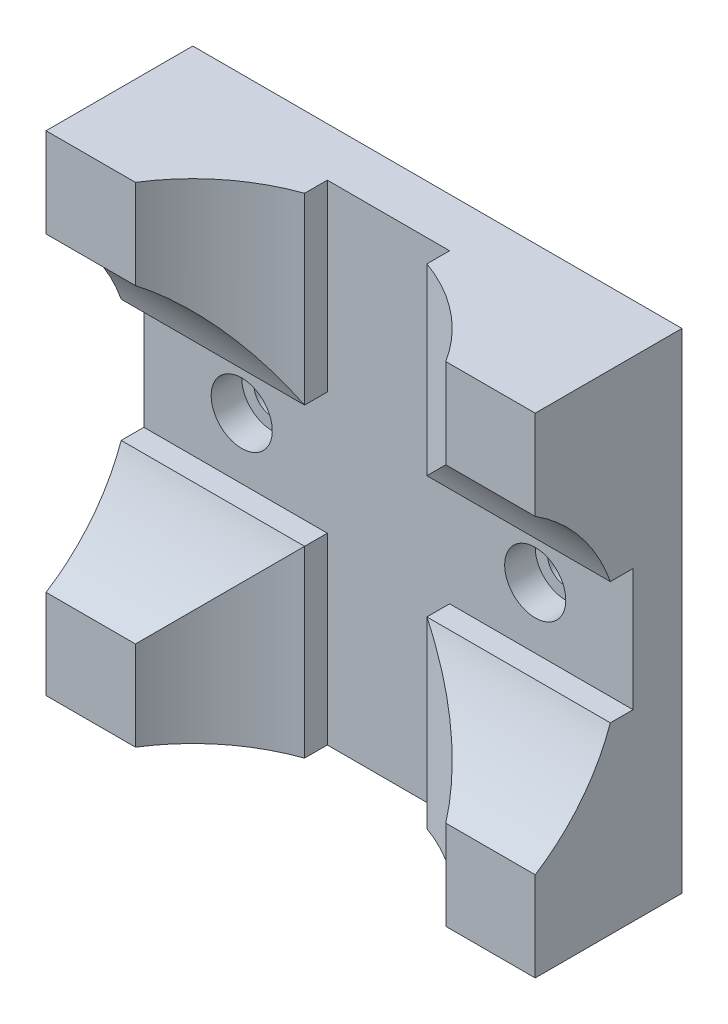
ISO-10303-21;
HEADER;
FILE_DESCRIPTION(('STEP AP214'),'2;1');
FILE_NAME('part.step','',(''),(''),'','','');
FILE_SCHEMA(('AUTOMOTIVE_DESIGN { 1 0 10303 214 1 1 1 1 }'));
ENDSEC;
DATA;
#1=APPLICATION_CONTEXT('core data for automotive mechanical design processes');
#2=APPLICATION_PROTOCOL_DEFINITION('international standard','automotive_design',2000,#1);
#3=PRODUCT_CONTEXT('',#1,'mechanical');
#4=PRODUCT('Part','Part','',(#3));
#5=PRODUCT_RELATED_PRODUCT_CATEGORY('part','',(#4));
#6=PRODUCT_DEFINITION_FORMATION('','',#4);
#7=PRODUCT_DEFINITION_CONTEXT('part definition',#1,'design');
#8=PRODUCT_DEFINITION('design','',#6,#7);
#9=PRODUCT_DEFINITION_SHAPE('','',#8);
#10=(LENGTH_UNIT() NAMED_UNIT(*) SI_UNIT(.MILLI.,.METRE.));
#11=(NAMED_UNIT(*) PLANE_ANGLE_UNIT() SI_UNIT($,.RADIAN.));
#12=(NAMED_UNIT(*) SI_UNIT($,.STERADIAN.) SOLID_ANGLE_UNIT());
#13=UNCERTAINTY_MEASURE_WITH_UNIT(LENGTH_MEASURE(1.E-05),#10,'distance_accuracy_value','');
#14=(GEOMETRIC_REPRESENTATION_CONTEXT(3) GLOBAL_UNCERTAINTY_ASSIGNED_CONTEXT((#13)) GLOBAL_UNIT_ASSIGNED_CONTEXT((#10,
#11,#12)) REPRESENTATION_CONTEXT('',''));
#15=CARTESIAN_POINT('',(0.,0.,0.));
#16=DIRECTION('',(0.,0.,1.));
#17=DIRECTION('',(1.,0.,0.));
#18=AXIS2_PLACEMENT_3D('',#15,#16,#17);
#19=CARTESIAN_POINT('',(0.,0.,12.));
#20=DIRECTION('',(0.,0.,-1.));
#21=DIRECTION('',(-1.,0.,0.));
#22=AXIS2_PLACEMENT_3D('',#19,#20,#21);
#23=PLANE('',#22);
#24=DIRECTION('',(-1.,0.,0.));
#25=VECTOR('',#24,1.);
#26=CARTESIAN_POINT('',(0.,40.,12.));
#27=LINE('',#26,#25);
#28=CARTESIAN_POINT('',(40.,40.,12.));
#29=VERTEX_POINT('',#28);
#30=CARTESIAN_POINT('',(32.6885775404496,40.,12.));
#31=VERTEX_POINT('',#30);
#32=EDGE_CURVE('E395',#29,#31,#27,.T.);
#33=ORIENTED_EDGE('',*,*,#32,.T.);
#34=DIRECTION('',(0.,-1.,0.));
#35=VECTOR('',#34,1.);
#36=CARTESIAN_POINT('',(32.6885775404496,40.,12.));
#37=LINE('',#36,#35);
#38=CARTESIAN_POINT('',(32.6885775404496,32.6885775404495,12.));
#39=VERTEX_POINT('',#38);
#40=EDGE_CURVE('E303',#31,#39,#37,.T.);
#41=ORIENTED_EDGE('',*,*,#40,.T.);
#42=DIRECTION('',(1.,0.,0.));
#43=VECTOR('',#42,1.);
#44=CARTESIAN_POINT('',(0.,32.6885775404495,12.));
#45=LINE('',#44,#43);
#46=CARTESIAN_POINT('',(40.,32.6885775404495,12.));
#47=VERTEX_POINT('',#46);
#48=EDGE_CURVE('E432',#39,#47,#45,.T.);
#49=ORIENTED_EDGE('',*,*,#48,.T.);
#50=DIRECTION('',(0.,1.,0.));
#51=VECTOR('',#50,1.);
#52=CARTESIAN_POINT('',(40.,0.,12.));
#53=LINE('',#52,#51);
#54=EDGE_CURVE('E389',#47,#29,#53,.T.);
#55=ORIENTED_EDGE('',*,*,#54,.T.);
#56=EDGE_LOOP('',(#33,#41,#49,#55));
#57=FACE_BOUND('',#56,.T.);
#58=ADVANCED_FACE('F52',(#57),#23,.F.);
#59=DIRECTION('',(1.,0.,0.));
#60=VECTOR('',#59,1.);
#61=CARTESIAN_POINT('',(0.,7.31142245955047,12.));
#62=LINE('',#61,#60);
#63=CARTESIAN_POINT('',(40.,7.31142245955048,12.));
#64=VERTEX_POINT('',#63);
#65=CARTESIAN_POINT('',(32.6885775404495,7.31142245955048,12.));
#66=VERTEX_POINT('',#65);
#67=EDGE_CURVE('E428',#64,#66,#62,.F.);
#68=ORIENTED_EDGE('',*,*,#67,.T.);
#69=DIRECTION('',(0.,-1.,0.));
#70=VECTOR('',#69,1.);
#71=CARTESIAN_POINT('',(32.6885775404496,40.,12.));
#72=LINE('',#71,#70);
#73=CARTESIAN_POINT('',(32.6885775404495,0.,12.));
#74=VERTEX_POINT('',#73);
#75=EDGE_CURVE('E279',#66,#74,#72,.T.);
#76=ORIENTED_EDGE('',*,*,#75,.T.);
#77=DIRECTION('',(1.,0.,0.));
#78=VECTOR('',#77,1.);
#79=CARTESIAN_POINT('',(0.,0.,12.));
#80=LINE('',#79,#78);
#81=CARTESIAN_POINT('',(40.,0.,12.));
#82=VERTEX_POINT('',#81);
#83=EDGE_CURVE('E383',#74,#82,#80,.T.);
#84=ORIENTED_EDGE('',*,*,#83,.T.);
#85=EDGE_CURVE('E390',#82,#64,#53,.T.);
#86=ORIENTED_EDGE('',*,*,#85,.T.);
#87=EDGE_LOOP('',(#68,#76,#84,#86));
#88=FACE_BOUND('',#87,.T.);
#89=ADVANCED_FACE('F461',(#88),#23,.F.);
#90=CARTESIAN_POINT('',(0.,20.,20.));
#91=DIRECTION('',(1.,0.,0.));
#92=DIRECTION('',(0.,1.,0.));
#93=AXIS2_PLACEMENT_3D('',#90,#91,#92);
#94=CYLINDRICAL_SURFACE('',#93,15.);
#95=ORIENTED_EDGE('',*,*,#48,.F.);
#96=CARTESIAN_POINT('',(20.,20.,20.));
#97=DIRECTION('',(0.707106781186546,-0.707106781186549,0.));
#98=DIRECTION('',(0.707106781186549,0.707106781186546,0.));
#99=AXIS2_PLACEMENT_3D('',#96,#97,#98);
#100=ELLIPSE('',#99,21.2132034355965,15.);
#101=CARTESIAN_POINT('',(25.,25.,5.85786437626905));
#102=VERTEX_POINT('',#101);
#103=EDGE_CURVE('E299',#39,#102,#100,.F.);
#104=ORIENTED_EDGE('',*,*,#103,.T.);
#105=DIRECTION('',(1.,0.,0.));
#106=VECTOR('',#105,1.);
#107=CARTESIAN_POINT('',(0.,25.,5.85786437626905));
#108=LINE('',#107,#106);
#109=CARTESIAN_POINT('',(40.,25.,5.85786437626905));
#110=VERTEX_POINT('',#109);
#111=EDGE_CURVE('E370',#102,#110,#108,.T.);
#112=ORIENTED_EDGE('',*,*,#111,.T.);
#113=CARTESIAN_POINT('',(40.,20.,20.));
#114=DIRECTION('',(1.,0.,0.));
#115=DIRECTION('',(0.,1.,0.));
#116=AXIS2_PLACEMENT_3D('',#113,#114,#115);
#117=CIRCLE('',#116,15.);
#118=EDGE_CURVE('E353',#110,#47,#117,.T.);
#119=ORIENTED_EDGE('',*,*,#118,.T.);
#120=EDGE_LOOP('',(#95,#104,#112,#119));
#121=FACE_BOUND('',#120,.T.);
#122=ADVANCED_FACE('F472',(#121),#94,.F.);
#123=CARTESIAN_POINT('',(7.31142245955043,7.31142245955047,12.));
#124=VERTEX_POINT('',#123);
#125=CARTESIAN_POINT('',(0.,7.31142245955047,12.));
#126=VERTEX_POINT('',#125);
#127=EDGE_CURVE('E427',#124,#126,#62,.F.);
#128=ORIENTED_EDGE('',*,*,#127,.F.);
#129=CARTESIAN_POINT('',(20.,20.,20.));
#130=DIRECTION('',(0.707106781186546,-0.707106781186549,0.));
#131=DIRECTION('',(0.707106781186549,0.707106781186546,0.));
#132=AXIS2_PLACEMENT_3D('',#129,#130,#131);
#133=ELLIPSE('',#132,21.2132034355965,15.);
#134=CARTESIAN_POINT('',(15.,15.,5.85786437626905));
#135=VERTEX_POINT('',#134);
#136=EDGE_CURVE('E283',#124,#135,#133,.T.);
#137=ORIENTED_EDGE('',*,*,#136,.T.);
#138=DIRECTION('',(1.,0.,0.));
#139=VECTOR('',#138,1.);
#140=CARTESIAN_POINT('',(0.,15.,5.85786437626905));
#141=LINE('',#140,#139);
#142=CARTESIAN_POINT('',(0.,15.,5.85786437626905));
#143=VERTEX_POINT('',#142);
#144=EDGE_CURVE('E360',#143,#135,#141,.T.);
#145=ORIENTED_EDGE('',*,*,#144,.F.);
#146=CARTESIAN_POINT('',(0.,20.,20.));
#147=DIRECTION('',(1.,0.,0.));
#148=DIRECTION('',(0.,1.,0.));
#149=AXIS2_PLACEMENT_3D('',#146,#147,#148);
#150=CIRCLE('',#149,15.);
#151=EDGE_CURVE('E337',#126,#143,#150,.T.);
#152=ORIENTED_EDGE('',*,*,#151,.F.);
#153=EDGE_LOOP('',(#128,#137,#145,#152));
#154=FACE_BOUND('',#153,.T.);
#155=ADVANCED_FACE('F548',(#154),#94,.F.);
#156=CARTESIAN_POINT('',(0.,15.,5.));
#157=DIRECTION('',(0.,-1.,0.));
#158=DIRECTION('',(1.,0.,0.));
#159=AXIS2_PLACEMENT_3D('',#156,#157,#158);
#160=PLANE('',#159);
#161=ORIENTED_EDGE('',*,*,#144,.T.);
#162=DIRECTION('',(0.,0.,-1.));
#163=VECTOR('',#162,1.);
#164=CARTESIAN_POINT('',(15.,15.,5.));
#165=LINE('',#164,#163);
#166=CARTESIAN_POINT('',(15.,15.,4.));
#167=VERTEX_POINT('',#166);
#168=EDGE_CURVE('E271',#135,#167,#165,.T.);
#169=ORIENTED_EDGE('',*,*,#168,.T.);
#170=DIRECTION('',(1.,0.,0.));
#171=VECTOR('',#170,1.);
#172=CARTESIAN_POINT('',(0.,15.,4.));
#173=LINE('',#172,#171);
#174=CARTESIAN_POINT('',(0.,15.,4.));
#175=VERTEX_POINT('',#174);
#176=EDGE_CURVE('E375',#175,#167,#173,.T.);
#177=ORIENTED_EDGE('',*,*,#176,.F.);
#178=DIRECTION('',(0.,0.,-1.));
#179=VECTOR('',#178,1.);
#180=CARTESIAN_POINT('',(0.,15.,4.));
#181=LINE('',#180,#179);
#182=EDGE_CURVE('E324',#143,#175,#181,.T.);
#183=ORIENTED_EDGE('',*,*,#182,.F.);
#184=EDGE_LOOP('',(#161,#169,#177,#183));
#185=FACE_BOUND('',#184,.T.);
#186=ADVANCED_FACE('F544',(#185),#160,.F.);
#187=CARTESIAN_POINT('',(0.,25.,5.85786437626905));
#188=DIRECTION('',(0.,1.,0.));
#189=DIRECTION('',(-1.,0.,0.));
#190=AXIS2_PLACEMENT_3D('',#187,#188,#189);
#191=PLANE('',#190);
#192=DIRECTION('',(1.,0.,0.));
#193=VECTOR('',#192,1.);
#194=CARTESIAN_POINT('',(0.,25.,4.));
#195=LINE('',#194,#193);
#196=CARTESIAN_POINT('',(0.,25.,4.));
#197=VERTEX_POINT('',#196);
#198=CARTESIAN_POINT('',(15.,25.,4.));
#199=VERTEX_POINT('',#198);
#200=EDGE_CURVE('E371',#197,#199,#195,.T.);
#201=ORIENTED_EDGE('',*,*,#200,.T.);
#202=DIRECTION('',(0.,0.,1.));
#203=VECTOR('',#202,1.);
#204=CARTESIAN_POINT('',(15.,25.,5.85786437626905));
#205=LINE('',#204,#203);
#206=CARTESIAN_POINT('',(15.,25.,5.85786437626905));
#207=VERTEX_POINT('',#206);
#208=EDGE_CURVE('E205',#199,#207,#205,.T.);
#209=ORIENTED_EDGE('',*,*,#208,.T.);
#210=CARTESIAN_POINT('',(0.,25.,5.85786437626905));
#211=VERTEX_POINT('',#210);
#212=EDGE_CURVE('E366',#211,#207,#108,.T.);
#213=ORIENTED_EDGE('',*,*,#212,.F.);
#214=DIRECTION('',(0.,0.,1.));
#215=VECTOR('',#214,1.);
#216=CARTESIAN_POINT('',(0.,25.,5.));
#217=LINE('',#216,#215);
#218=EDGE_CURVE('E333',#197,#211,#217,.T.);
#219=ORIENTED_EDGE('',*,*,#218,.F.);
#220=EDGE_LOOP('',(#201,#209,#213,#219));
#221=FACE_BOUND('',#220,.T.);
#222=ADVANCED_FACE('F462',(#221),#191,.F.);
#223=CARTESIAN_POINT('',(32.,20.,40.));
#224=DIRECTION('',(0.,0.,-1.));
#225=DIRECTION('',(-1.,0.,0.));
#226=AXIS2_PLACEMENT_3D('',#223,#224,#225);
#227=CYLINDRICAL_SURFACE('',#226,2.5);
#228=CARTESIAN_POINT('',(32.,20.,4.));
#229=DIRECTION('',(0.,0.,-1.));
#230=DIRECTION('',(0.,1.,0.));
#231=AXIS2_PLACEMENT_3D('',#228,#229,#230);
#232=CIRCLE('',#231,2.5);
#233=CARTESIAN_POINT('',(32.,22.5,4.));
#234=VERTEX_POINT('',#233);
#235=EDGE_CURVE('E348',#234,#234,#232,.T.);
#236=ORIENTED_EDGE('',*,*,#235,.F.);
#237=EDGE_LOOP('',(#236));
#238=FACE_BOUND('',#237,.T.);
#239=CARTESIAN_POINT('',(32.,20.,1.5));
#240=DIRECTION('',(0.,0.,-1.));
#241=DIRECTION('',(-1.,0.,0.));
#242=AXIS2_PLACEMENT_3D('',#239,#240,#241);
#243=CIRCLE('',#242,2.5);
#244=CARTESIAN_POINT('',(29.5,20.,1.5));
#245=VERTEX_POINT('',#244);
#246=EDGE_CURVE('E12',#245,#245,#243,.F.);
#247=ORIENTED_EDGE('',*,*,#246,.F.);
#248=EDGE_LOOP('',(#247));
#249=FACE_BOUND('',#248,.T.);
#250=ADVANCED_FACE('F451',(#238,#249),#227,.F.);
#251=CARTESIAN_POINT('',(8.,20.,40.));
#252=DIRECTION('',(0.,0.,-1.));
#253=DIRECTION('',(-1.,0.,0.));
#254=AXIS2_PLACEMENT_3D('',#251,#252,#253);
#255=CYLINDRICAL_SURFACE('',#254,2.5);
#256=CARTESIAN_POINT('',(8.,20.,4.));
#257=DIRECTION('',(0.,0.,-1.));
#258=DIRECTION('',(0.,1.,0.));
#259=AXIS2_PLACEMENT_3D('',#256,#257,#258);
#260=CIRCLE('',#259,2.5);
#261=CARTESIAN_POINT('',(8.,22.5,4.));
#262=VERTEX_POINT('',#261);
#263=EDGE_CURVE('E320',#262,#262,#260,.T.);
#264=ORIENTED_EDGE('',*,*,#263,.F.);
#265=EDGE_LOOP('',(#264));
#266=FACE_BOUND('',#265,.T.);
#267=CARTESIAN_POINT('',(8.,20.,1.5));
#268=DIRECTION('',(0.,0.,-1.));
#269=DIRECTION('',(-1.,0.,0.));
#270=AXIS2_PLACEMENT_3D('',#267,#268,#269);
#271=CIRCLE('',#270,2.5);
#272=CARTESIAN_POINT('',(5.5,20.,1.5));
#273=VERTEX_POINT('',#272);
#274=EDGE_CURVE('E61',#273,#273,#271,.F.);
#275=ORIENTED_EDGE('',*,*,#274,.F.);
#276=EDGE_LOOP('',(#275));
#277=FACE_BOUND('',#276,.T.);
#278=ADVANCED_FACE('F448',(#266,#277),#255,.F.);
#279=CARTESIAN_POINT('',(0.,32.6885775404495,12.));
#280=VERTEX_POINT('',#279);
#281=CARTESIAN_POINT('',(7.31142245955052,32.6885775404495,12.));
#282=VERTEX_POINT('',#281);
#283=EDGE_CURVE('E433',#280,#282,#45,.T.);
#284=ORIENTED_EDGE('',*,*,#283,.T.);
#285=DIRECTION('',(0.,-1.,0.));
#286=VECTOR('',#285,1.);
#287=CARTESIAN_POINT('',(7.31142245955054,40.,12.));
#288=LINE('',#287,#286);
#289=CARTESIAN_POINT('',(7.31142245955054,40.,12.));
#290=VERTEX_POINT('',#289);
#291=EDGE_CURVE('E295',#282,#290,#288,.F.);
#292=ORIENTED_EDGE('',*,*,#291,.T.);
#293=CARTESIAN_POINT('',(0.,40.,12.));
#294=VERTEX_POINT('',#293);
#295=EDGE_CURVE('E394',#290,#294,#27,.T.);
#296=ORIENTED_EDGE('',*,*,#295,.T.);
#297=DIRECTION('',(0.,-1.,0.));
#298=VECTOR('',#297,1.);
#299=CARTESIAN_POINT('',(0.,0.,12.));
#300=LINE('',#299,#298);
#301=EDGE_CURVE('E379',#294,#280,#300,.T.);
#302=ORIENTED_EDGE('',*,*,#301,.T.);
#303=EDGE_LOOP('',(#284,#292,#296,#302));
#304=FACE_BOUND('',#303,.T.);
#305=ADVANCED_FACE('F450',(#304),#23,.F.);
#306=CARTESIAN_POINT('',(0.,0.,12.));
#307=DIRECTION('',(1.,0.,0.));
#308=DIRECTION('',(0.,1.,0.));
#309=AXIS2_PLACEMENT_3D('',#306,#307,#308);
#310=PLANE('',#309);
#311=CARTESIAN_POINT('',(0.,0.,12.));
#312=VERTEX_POINT('',#311);
#313=EDGE_CURVE('E384',#126,#312,#300,.T.);
#314=ORIENTED_EDGE('',*,*,#313,.F.);
#315=ORIENTED_EDGE('',*,*,#151,.T.);
#316=ORIENTED_EDGE('',*,*,#182,.T.);
#317=DIRECTION('',(0.,1.,0.));
#318=VECTOR('',#317,1.);
#319=CARTESIAN_POINT('',(0.,25.,4.));
#320=LINE('',#319,#318);
#321=EDGE_CURVE('E328',#175,#197,#320,.T.);
#322=ORIENTED_EDGE('',*,*,#321,.T.);
#323=ORIENTED_EDGE('',*,*,#218,.T.);
#324=EDGE_CURVE('E338',#211,#280,#150,.T.);
#325=ORIENTED_EDGE('',*,*,#324,.T.);
#326=ORIENTED_EDGE('',*,*,#301,.F.);
#327=DIRECTION('',(0.,0.,-1.));
#328=VECTOR('',#327,1.);
#329=CARTESIAN_POINT('',(0.,40.,12.));
#330=LINE('',#329,#328);
#331=CARTESIAN_POINT('',(0.,40.,0.));
#332=VERTEX_POINT('',#331);
#333=EDGE_CURVE('E399',#294,#332,#330,.T.);
#334=ORIENTED_EDGE('',*,*,#333,.T.);
#335=DIRECTION('',(0.,-1.,0.));
#336=VECTOR('',#335,1.);
#337=CARTESIAN_POINT('',(0.,0.,0.));
#338=LINE('',#337,#336);
#339=CARTESIAN_POINT('',(0.,0.,0.));
#340=VERTEX_POINT('',#339);
#341=EDGE_CURVE('E364',#332,#340,#338,.T.);
#342=ORIENTED_EDGE('',*,*,#341,.T.);
#343=DIRECTION('',(0.,0.,-1.));
#344=VECTOR('',#343,1.);
#345=CARTESIAN_POINT('',(0.,0.,12.));
#346=LINE('',#345,#344);
#347=EDGE_CURVE('E423',#312,#340,#346,.T.);
#348=ORIENTED_EDGE('',*,*,#347,.F.);
#349=EDGE_LOOP('',(#314,#315,#316,#322,#323,#325,#326,#334,#342,#348));
#350=FACE_BOUND('',#349,.T.);
#351=ADVANCED_FACE('F54',(#350),#310,.F.);
#352=CARTESIAN_POINT('',(0.,0.,12.));
#353=DIRECTION('',(0.,1.,0.));
#354=DIRECTION('',(0.,0.,1.));
#355=AXIS2_PLACEMENT_3D('',#352,#353,#354);
#356=PLANE('',#355);
#357=DIRECTION('',(0.,0.,-1.));
#358=VECTOR('',#357,1.);
#359=CARTESIAN_POINT('',(14.9999999999999,0.,5.));
#360=LINE('',#359,#358);
#361=CARTESIAN_POINT('',(14.9999999999999,0.,5.85786437626905));
#362=VERTEX_POINT('',#361);
#363=CARTESIAN_POINT('',(14.9999999999999,0.,4.));
#364=VERTEX_POINT('',#363);
#365=EDGE_CURVE('E227',#362,#364,#360,.T.);
#366=ORIENTED_EDGE('',*,*,#365,.F.);
#367=CARTESIAN_POINT('',(19.9999999999999,0.,20.));
#368=DIRECTION('',(0.,-1.,0.));
#369=DIRECTION('',(1.,0.,0.));
#370=AXIS2_PLACEMENT_3D('',#367,#368,#369);
#371=CIRCLE('',#370,15.);
#372=CARTESIAN_POINT('',(7.31142245955041,0.,12.));
#373=VERTEX_POINT('',#372);
#374=EDGE_CURVE('E247',#373,#362,#371,.T.);
#375=ORIENTED_EDGE('',*,*,#374,.F.);
#376=EDGE_CURVE('E385',#312,#373,#80,.T.);
#377=ORIENTED_EDGE('',*,*,#376,.F.);
#378=ORIENTED_EDGE('',*,*,#347,.T.);
#379=DIRECTION('',(1.,0.,0.));
#380=VECTOR('',#379,1.);
#381=CARTESIAN_POINT('',(0.,0.,0.));
#382=LINE('',#381,#380);
#383=CARTESIAN_POINT('',(40.,0.,0.));
#384=VERTEX_POINT('',#383);
#385=EDGE_CURVE('E403',#340,#384,#382,.T.);
#386=ORIENTED_EDGE('',*,*,#385,.T.);
#387=DIRECTION('',(0.,0.,-1.));
#388=VECTOR('',#387,1.);
#389=CARTESIAN_POINT('',(40.,0.,12.));
#390=LINE('',#389,#388);
#391=EDGE_CURVE('E419',#82,#384,#390,.T.);
#392=ORIENTED_EDGE('',*,*,#391,.F.);
#393=ORIENTED_EDGE('',*,*,#83,.F.);
#394=CARTESIAN_POINT('',(24.9999999999999,0.,5.85786437626905));
#395=VERTEX_POINT('',#394);
#396=EDGE_CURVE('E231',#395,#74,#371,.T.);
#397=ORIENTED_EDGE('',*,*,#396,.F.);
#398=DIRECTION('',(0.,0.,1.));
#399=VECTOR('',#398,1.);
#400=CARTESIAN_POINT('',(24.9999999999999,0.,5.85786437626905));
#401=LINE('',#400,#399);
#402=CARTESIAN_POINT('',(24.9999999999999,0.,4.));
#403=VERTEX_POINT('',#402);
#404=EDGE_CURVE('E243',#403,#395,#401,.T.);
#405=ORIENTED_EDGE('',*,*,#404,.F.);
#406=DIRECTION('',(1.,0.,0.));
#407=VECTOR('',#406,1.);
#408=CARTESIAN_POINT('',(24.9999999999999,0.,4.));
#409=LINE('',#408,#407);
#410=EDGE_CURVE('E240',#364,#403,#409,.T.);
#411=ORIENTED_EDGE('',*,*,#410,.F.);
#412=EDGE_LOOP('',(#366,#375,#377,#378,#386,#392,#393,#397,#405,#411));
#413=FACE_BOUND('',#412,.T.);
#414=ADVANCED_FACE('F494',(#413),#356,.F.);
#415=CARTESIAN_POINT('',(40.,0.,12.));
#416=DIRECTION('',(-1.,0.,0.));
#417=DIRECTION('',(0.,-1.,0.));
#418=AXIS2_PLACEMENT_3D('',#415,#416,#417);
#419=PLANE('',#418);
#420=DIRECTION('',(0.,0.,-1.));
#421=VECTOR('',#420,1.);
#422=CARTESIAN_POINT('',(40.,15.,5.));
#423=LINE('',#422,#421);
#424=CARTESIAN_POINT('',(40.,15.,5.85786437626905));
#425=VERTEX_POINT('',#424);
#426=CARTESIAN_POINT('',(40.,15.,4.));
#427=VERTEX_POINT('',#426);
#428=EDGE_CURVE('E329',#425,#427,#423,.T.);
#429=ORIENTED_EDGE('',*,*,#428,.F.);
#430=EDGE_CURVE('E352',#64,#425,#117,.T.);
#431=ORIENTED_EDGE('',*,*,#430,.F.);
#432=ORIENTED_EDGE('',*,*,#85,.F.);
#433=ORIENTED_EDGE('',*,*,#391,.T.);
#434=DIRECTION('',(0.,1.,0.));
#435=VECTOR('',#434,1.);
#436=CARTESIAN_POINT('',(40.,0.,0.));
#437=LINE('',#436,#435);
#438=CARTESIAN_POINT('',(40.,40.,0.));
#439=VERTEX_POINT('',#438);
#440=EDGE_CURVE('E406',#384,#439,#437,.T.);
#441=ORIENTED_EDGE('',*,*,#440,.T.);
#442=DIRECTION('',(0.,0.,-1.));
#443=VECTOR('',#442,1.);
#444=CARTESIAN_POINT('',(40.,40.,12.));
#445=LINE('',#444,#443);
#446=EDGE_CURVE('E415',#29,#439,#445,.T.);
#447=ORIENTED_EDGE('',*,*,#446,.F.);
#448=ORIENTED_EDGE('',*,*,#54,.F.);
#449=ORIENTED_EDGE('',*,*,#118,.F.);
#450=DIRECTION('',(0.,0.,1.));
#451=VECTOR('',#450,1.);
#452=CARTESIAN_POINT('',(40.,25.,5.85786437626905));
#453=LINE('',#452,#451);
#454=CARTESIAN_POINT('',(40.,25.,4.));
#455=VERTEX_POINT('',#454);
#456=EDGE_CURVE('E347',#455,#110,#453,.T.);
#457=ORIENTED_EDGE('',*,*,#456,.F.);
#458=DIRECTION('',(0.,1.,0.));
#459=VECTOR('',#458,1.);
#460=CARTESIAN_POINT('',(40.,25.,4.));
#461=LINE('',#460,#459);
#462=EDGE_CURVE('E343',#427,#455,#461,.T.);
#463=ORIENTED_EDGE('',*,*,#462,.F.);
#464=EDGE_LOOP('',(#429,#431,#432,#433,#441,#447,#448,#449,#457,#463));
#465=FACE_BOUND('',#464,.T.);
#466=ADVANCED_FACE('F485',(#465),#419,.F.);
#467=CARTESIAN_POINT('',(0.,40.,12.));
#468=DIRECTION('',(0.,-1.,0.));
#469=DIRECTION('',(0.,0.,-1.));
#470=AXIS2_PLACEMENT_3D('',#467,#468,#469);
#471=PLANE('',#470);
#472=ORIENTED_EDGE('',*,*,#295,.F.);
#473=CARTESIAN_POINT('',(20.0000000000001,40.,20.));
#474=DIRECTION('',(0.,-1.,0.));
#475=DIRECTION('',(1.,0.,0.));
#476=AXIS2_PLACEMENT_3D('',#473,#474,#475);
#477=CIRCLE('',#476,15.);
#478=CARTESIAN_POINT('',(15.0000000000001,40.,5.85786437626905));
#479=VERTEX_POINT('',#478);
#480=EDGE_CURVE('E225',#290,#479,#477,.T.);
#481=ORIENTED_EDGE('',*,*,#480,.T.);
#482=DIRECTION('',(0.,0.,-1.));
#483=VECTOR('',#482,1.);
#484=CARTESIAN_POINT('',(15.0000000000001,40.,4.));
#485=LINE('',#484,#483);
#486=CARTESIAN_POINT('',(15.0000000000001,40.,4.));
#487=VERTEX_POINT('',#486);
#488=EDGE_CURVE('E202',#479,#487,#485,.T.);
#489=ORIENTED_EDGE('',*,*,#488,.T.);
#490=DIRECTION('',(1.,0.,0.));
#491=VECTOR('',#490,1.);
#492=CARTESIAN_POINT('',(25.0000000000001,40.,4.));
#493=LINE('',#492,#491);
#494=CARTESIAN_POINT('',(25.0000000000001,40.,4.));
#495=VERTEX_POINT('',#494);
#496=EDGE_CURVE('E211',#487,#495,#493,.T.);
#497=ORIENTED_EDGE('',*,*,#496,.T.);
#498=DIRECTION('',(0.,0.,1.));
#499=VECTOR('',#498,1.);
#500=CARTESIAN_POINT('',(25.0000000000001,40.,5.));
#501=LINE('',#500,#499);
#502=CARTESIAN_POINT('',(25.0000000000001,40.,5.85786437626905));
#503=VERTEX_POINT('',#502);
#504=EDGE_CURVE('E220',#495,#503,#501,.T.);
#505=ORIENTED_EDGE('',*,*,#504,.T.);
#506=EDGE_CURVE('E236',#503,#31,#477,.T.);
#507=ORIENTED_EDGE('',*,*,#506,.T.);
#508=ORIENTED_EDGE('',*,*,#32,.F.);
#509=ORIENTED_EDGE('',*,*,#446,.T.);
#510=DIRECTION('',(-1.,0.,0.));
#511=VECTOR('',#510,1.);
#512=CARTESIAN_POINT('',(0.,40.,0.));
#513=LINE('',#512,#511);
#514=EDGE_CURVE('E409',#439,#332,#513,.T.);
#515=ORIENTED_EDGE('',*,*,#514,.T.);
#516=ORIENTED_EDGE('',*,*,#333,.F.);
#517=EDGE_LOOP('',(#472,#481,#489,#497,#505,#507,#508,#509,#515,#516));
#518=FACE_BOUND('',#517,.T.);
#519=ADVANCED_FACE('F224',(#518),#471,.F.);
#520=ORIENTED_EDGE('',*,*,#376,.T.);
#521=DIRECTION('',(0.,-1.,0.));
#522=VECTOR('',#521,1.);
#523=CARTESIAN_POINT('',(7.31142245955054,40.,12.));
#524=LINE('',#523,#522);
#525=EDGE_CURVE('E287',#373,#124,#524,.F.);
#526=ORIENTED_EDGE('',*,*,#525,.T.);
#527=ORIENTED_EDGE('',*,*,#127,.T.);
#528=ORIENTED_EDGE('',*,*,#313,.T.);
#529=EDGE_LOOP('',(#520,#526,#527,#528));
#530=FACE_BOUND('',#529,.T.);
#531=ADVANCED_FACE('F460',(#530),#23,.F.);
#532=CARTESIAN_POINT('',(0.,0.,0.));
#533=DIRECTION('',(0.,0.,-1.));
#534=DIRECTION('',(-1.,0.,0.));
#535=AXIS2_PLACEMENT_3D('',#532,#533,#534);
#536=PLANE('',#535);
#537=ORIENTED_EDGE('',*,*,#341,.F.);
#538=ORIENTED_EDGE('',*,*,#514,.F.);
#539=ORIENTED_EDGE('',*,*,#440,.F.);
#540=ORIENTED_EDGE('',*,*,#385,.F.);
#541=EDGE_LOOP('',(#537,#538,#539,#540));
#542=FACE_BOUND('',#541,.T.);
#543=CARTESIAN_POINT('',(8.,20.,0.));
#544=DIRECTION('',(0.,0.,-1.));
#545=DIRECTION('',(-1.,0.,0.));
#546=AXIS2_PLACEMENT_3D('',#543,#544,#545);
#547=CIRCLE('',#546,1.5);
#548=CARTESIAN_POINT('',(6.5,20.,0.));
#549=VERTEX_POINT('',#548);
#550=EDGE_CURVE('E312',#549,#549,#547,.T.);
#551=ORIENTED_EDGE('',*,*,#550,.F.);
#552=EDGE_LOOP('',(#551));
#553=FACE_BOUND('',#552,.T.);
#554=CARTESIAN_POINT('',(32.,20.,0.));
#555=DIRECTION('',(0.,0.,-1.));
#556=DIRECTION('',(-1.,0.,0.));
#557=AXIS2_PLACEMENT_3D('',#554,#555,#556);
#558=CIRCLE('',#557,1.5);
#559=CARTESIAN_POINT('',(30.5,20.,0.));
#560=VERTEX_POINT('',#559);
#561=EDGE_CURVE('E308',#560,#560,#558,.T.);
#562=ORIENTED_EDGE('',*,*,#561,.F.);
#563=EDGE_LOOP('',(#562));
#564=FACE_BOUND('',#563,.T.);
#565=ADVANCED_FACE('F477',(#542,#553,#564),#536,.T.);
#566=ORIENTED_EDGE('',*,*,#212,.T.);
#567=CARTESIAN_POINT('',(20.,20.,20.));
#568=DIRECTION('',(0.707106781186549,0.707106781186546,0.));
#569=DIRECTION('',(0.707106781186546,-0.707106781186549,0.));
#570=AXIS2_PLACEMENT_3D('',#567,#568,#569);
#571=ELLIPSE('',#570,21.2132034355964,15.);
#572=EDGE_CURVE('E291',#207,#282,#571,.T.);
#573=ORIENTED_EDGE('',*,*,#572,.T.);
#574=ORIENTED_EDGE('',*,*,#283,.F.);
#575=ORIENTED_EDGE('',*,*,#324,.F.);
#576=EDGE_LOOP('',(#566,#573,#574,#575));
#577=FACE_BOUND('',#576,.T.);
#578=ADVANCED_FACE('F483',(#577),#94,.F.);
#579=CARTESIAN_POINT('',(25.,15.,5.85786437626905));
#580=VERTEX_POINT('',#579);
#581=EDGE_CURVE('E365',#580,#425,#141,.T.);
#582=ORIENTED_EDGE('',*,*,#581,.F.);
#583=CARTESIAN_POINT('',(20.,20.,20.));
#584=DIRECTION('',(0.707106781186549,0.707106781186546,0.));
#585=DIRECTION('',(0.707106781186546,-0.707106781186549,0.));
#586=AXIS2_PLACEMENT_3D('',#583,#584,#585);
#587=ELLIPSE('',#586,21.2132034355964,15.);
#588=EDGE_CURVE('E275',#580,#66,#587,.F.);
#589=ORIENTED_EDGE('',*,*,#588,.T.);
#590=ORIENTED_EDGE('',*,*,#67,.F.);
#591=ORIENTED_EDGE('',*,*,#430,.T.);
#592=EDGE_LOOP('',(#582,#589,#590,#591));
#593=FACE_BOUND('',#592,.T.);
#594=ADVANCED_FACE('F602',(#593),#94,.F.);
#595=CARTESIAN_POINT('',(25.,15.,4.));
#596=VERTEX_POINT('',#595);
#597=EDGE_CURVE('E342',#596,#427,#173,.T.);
#598=ORIENTED_EDGE('',*,*,#597,.F.);
#599=DIRECTION('',(0.,0.,1.));
#600=VECTOR('',#599,1.);
#601=CARTESIAN_POINT('',(25.,15.,5.));
#602=LINE('',#601,#600);
#603=EDGE_CURVE('E265',#596,#580,#602,.T.);
#604=ORIENTED_EDGE('',*,*,#603,.T.);
#605=ORIENTED_EDGE('',*,*,#581,.T.);
#606=ORIENTED_EDGE('',*,*,#428,.T.);
#607=EDGE_LOOP('',(#598,#604,#605,#606));
#608=FACE_BOUND('',#607,.T.);
#609=ADVANCED_FACE('F558',(#608),#160,.F.);
#610=ORIENTED_EDGE('',*,*,#111,.F.);
#611=DIRECTION('',(0.,0.,-1.));
#612=VECTOR('',#611,1.);
#613=CARTESIAN_POINT('',(25.,25.,5.85786437626905));
#614=LINE('',#613,#612);
#615=CARTESIAN_POINT('',(25.,25.,4.));
#616=VERTEX_POINT('',#615);
#617=EDGE_CURVE('E253',#102,#616,#614,.T.);
#618=ORIENTED_EDGE('',*,*,#617,.T.);
#619=EDGE_CURVE('E374',#616,#455,#195,.T.);
#620=ORIENTED_EDGE('',*,*,#619,.T.);
#621=ORIENTED_EDGE('',*,*,#456,.T.);
#622=EDGE_LOOP('',(#610,#618,#620,#621));
#623=FACE_BOUND('',#622,.T.);
#624=ADVANCED_FACE('F562',(#623),#191,.F.);
#625=CARTESIAN_POINT('',(0.,25.,4.));
#626=DIRECTION('',(0.,0.,-1.));
#627=DIRECTION('',(0.,1.,0.));
#628=AXIS2_PLACEMENT_3D('',#625,#626,#627);
#629=PLANE('',#628);
#630=ORIENTED_EDGE('',*,*,#235,.T.);
#631=EDGE_LOOP('',(#630));
#632=FACE_BOUND('',#631,.T.);
#633=ORIENTED_EDGE('',*,*,#619,.F.);
#634=DIRECTION('',(0.,-1.,0.));
#635=VECTOR('',#634,1.);
#636=CARTESIAN_POINT('',(25.0000000000001,40.,4.));
#637=LINE('',#636,#635);
#638=EDGE_CURVE('E215',#495,#616,#637,.T.);
#639=ORIENTED_EDGE('',*,*,#638,.F.);
#640=ORIENTED_EDGE('',*,*,#496,.F.);
#641=DIRECTION('',(0.,-1.,0.));
#642=VECTOR('',#641,1.);
#643=CARTESIAN_POINT('',(15.0000000000001,40.,4.));
#644=LINE('',#643,#642);
#645=EDGE_CURVE('E75',#487,#199,#644,.T.);
#646=ORIENTED_EDGE('',*,*,#645,.T.);
#647=ORIENTED_EDGE('',*,*,#200,.F.);
#648=ORIENTED_EDGE('',*,*,#321,.F.);
#649=ORIENTED_EDGE('',*,*,#176,.T.);
#650=EDGE_CURVE('E208',#167,#364,#644,.T.);
#651=ORIENTED_EDGE('',*,*,#650,.T.);
#652=ORIENTED_EDGE('',*,*,#410,.T.);
#653=EDGE_CURVE('E68',#596,#403,#637,.T.);
#654=ORIENTED_EDGE('',*,*,#653,.F.);
#655=ORIENTED_EDGE('',*,*,#597,.T.);
#656=ORIENTED_EDGE('',*,*,#462,.T.);
#657=EDGE_LOOP('',(#633,#639,#640,#646,#647,#648,#649,#651,#652,#654,#655,#656));
#658=FACE_BOUND('',#657,.T.);
#659=ORIENTED_EDGE('',*,*,#263,.T.);
#660=EDGE_LOOP('',(#659));
#661=FACE_BOUND('',#660,.T.);
#662=ADVANCED_FACE('F213',(#632,#658,#661),#629,.F.);
#663=CARTESIAN_POINT('',(8.,20.,1.5));
#664=DIRECTION('',(0.,0.,-1.));
#665=DIRECTION('',(-1.,0.,0.));
#666=AXIS2_PLACEMENT_3D('',#663,#664,#665);
#667=PLANE('',#666);
#668=CARTESIAN_POINT('',(8.,20.,1.5));
#669=DIRECTION('',(0.,0.,-1.));
#670=DIRECTION('',(-1.,0.,0.));
#671=AXIS2_PLACEMENT_3D('',#668,#669,#670);
#672=CIRCLE('',#671,1.5);
#673=CARTESIAN_POINT('',(6.5,20.,1.5));
#674=VERTEX_POINT('',#673);
#675=EDGE_CURVE('E316',#674,#674,#672,.T.);
#676=ORIENTED_EDGE('',*,*,#675,.T.);
#677=EDGE_LOOP('',(#676));
#678=FACE_BOUND('',#677,.T.);
#679=ORIENTED_EDGE('',*,*,#274,.T.);
#680=EDGE_LOOP('',(#679));
#681=FACE_BOUND('',#680,.T.);
#682=ADVANCED_FACE('F446',(#678,#681),#667,.F.);
#683=CARTESIAN_POINT('',(8.,20.,1.5));
#684=DIRECTION('',(0.,0.,-1.));
#685=DIRECTION('',(-1.,0.,0.));
#686=AXIS2_PLACEMENT_3D('',#683,#684,#685);
#687=CYLINDRICAL_SURFACE('',#686,1.5);
#688=ORIENTED_EDGE('',*,*,#675,.F.);
#689=EDGE_LOOP('',(#688));
#690=FACE_BOUND('',#689,.T.);
#691=ORIENTED_EDGE('',*,*,#550,.T.);
#692=EDGE_LOOP('',(#691));
#693=FACE_BOUND('',#692,.T.);
#694=ADVANCED_FACE('F630',(#690,#693),#687,.F.);
#695=CARTESIAN_POINT('',(32.,20.,1.5));
#696=DIRECTION('',(0.,0.,-1.));
#697=DIRECTION('',(-1.,0.,0.));
#698=AXIS2_PLACEMENT_3D('',#695,#696,#697);
#699=PLANE('',#698);
#700=CARTESIAN_POINT('',(32.,20.,1.5));
#701=DIRECTION('',(0.,0.,-1.));
#702=DIRECTION('',(-1.,0.,0.));
#703=AXIS2_PLACEMENT_3D('',#700,#701,#702);
#704=CIRCLE('',#703,1.5);
#705=CARTESIAN_POINT('',(30.5,20.,1.5));
#706=VERTEX_POINT('',#705);
#707=EDGE_CURVE('E307',#706,#706,#704,.T.);
#708=ORIENTED_EDGE('',*,*,#707,.T.);
#709=EDGE_LOOP('',(#708));
#710=FACE_BOUND('',#709,.T.);
#711=ORIENTED_EDGE('',*,*,#246,.T.);
#712=EDGE_LOOP('',(#711));
#713=FACE_BOUND('',#712,.T.);
#714=ADVANCED_FACE('F574',(#710,#713),#699,.F.);
#715=CARTESIAN_POINT('',(32.,20.,1.5));
#716=DIRECTION('',(0.,0.,-1.));
#717=DIRECTION('',(-1.,0.,0.));
#718=AXIS2_PLACEMENT_3D('',#715,#716,#717);
#719=CYLINDRICAL_SURFACE('',#718,1.5);
#720=ORIENTED_EDGE('',*,*,#707,.F.);
#721=EDGE_LOOP('',(#720));
#722=FACE_BOUND('',#721,.T.);
#723=ORIENTED_EDGE('',*,*,#561,.T.);
#724=EDGE_LOOP('',(#723));
#725=FACE_BOUND('',#724,.T.);
#726=ADVANCED_FACE('F566',(#722,#725),#719,.F.);
#727=CARTESIAN_POINT('',(25.0000000000001,40.,5.85786437626905));
#728=DIRECTION('',(1.,0.,0.));
#729=DIRECTION('',(0.,1.,0.));
#730=AXIS2_PLACEMENT_3D('',#727,#728,#729);
#731=PLANE('',#730);
#732=DIRECTION('',(0.,-1.,0.));
#733=VECTOR('',#732,1.);
#734=CARTESIAN_POINT('',(25.0000000000001,40.,5.85786437626905));
#735=LINE('',#734,#733);
#736=EDGE_CURVE('E255',#503,#102,#735,.T.);
#737=ORIENTED_EDGE('',*,*,#736,.F.);
#738=ORIENTED_EDGE('',*,*,#504,.F.);
#739=ORIENTED_EDGE('',*,*,#638,.T.);
#740=ORIENTED_EDGE('',*,*,#617,.F.);
#741=EDGE_LOOP('',(#737,#738,#739,#740));
#742=FACE_BOUND('',#741,.T.);
#743=ADVANCED_FACE('F564',(#742),#731,.F.);
#744=CARTESIAN_POINT('',(15.0000000000001,40.,5.));
#745=DIRECTION('',(-1.,0.,0.));
#746=DIRECTION('',(0.,-1.,0.));
#747=AXIS2_PLACEMENT_3D('',#744,#745,#746);
#748=PLANE('',#747);
#749=ORIENTED_EDGE('',*,*,#645,.F.);
#750=ORIENTED_EDGE('',*,*,#488,.F.);
#751=DIRECTION('',(0.,-1.,0.));
#752=VECTOR('',#751,1.);
#753=CARTESIAN_POINT('',(15.0000000000001,40.,5.85786437626905));
#754=LINE('',#753,#752);
#755=EDGE_CURVE('E250',#479,#207,#754,.T.);
#756=ORIENTED_EDGE('',*,*,#755,.T.);
#757=ORIENTED_EDGE('',*,*,#208,.F.);
#758=EDGE_LOOP('',(#749,#750,#756,#757));
#759=FACE_BOUND('',#758,.T.);
#760=ADVANCED_FACE('F199',(#759),#748,.F.);
#761=CARTESIAN_POINT('',(20.0000000000001,40.,20.));
#762=DIRECTION('',(0.,-1.,0.));
#763=DIRECTION('',(1.,0.,0.));
#764=AXIS2_PLACEMENT_3D('',#761,#762,#763);
#765=CYLINDRICAL_SURFACE('',#764,15.);
#766=ORIENTED_EDGE('',*,*,#572,.F.);
#767=ORIENTED_EDGE('',*,*,#755,.F.);
#768=ORIENTED_EDGE('',*,*,#480,.F.);
#769=ORIENTED_EDGE('',*,*,#291,.F.);
#770=EDGE_LOOP('',(#766,#767,#768,#769));
#771=FACE_BOUND('',#770,.T.);
#772=ADVANCED_FACE('F572',(#771),#765,.F.);
#773=ORIENTED_EDGE('',*,*,#506,.F.);
#774=ORIENTED_EDGE('',*,*,#736,.T.);
#775=ORIENTED_EDGE('',*,*,#103,.F.);
#776=ORIENTED_EDGE('',*,*,#40,.F.);
#777=EDGE_LOOP('',(#773,#774,#775,#776));
#778=FACE_BOUND('',#777,.T.);
#779=ADVANCED_FACE('F526',(#778),#765,.F.);
#780=ORIENTED_EDGE('',*,*,#374,.T.);
#781=EDGE_CURVE('E254',#135,#362,#754,.T.);
#782=ORIENTED_EDGE('',*,*,#781,.F.);
#783=ORIENTED_EDGE('',*,*,#136,.F.);
#784=ORIENTED_EDGE('',*,*,#525,.F.);
#785=EDGE_LOOP('',(#780,#782,#783,#784));
#786=FACE_BOUND('',#785,.T.);
#787=ADVANCED_FACE('F587',(#786),#765,.F.);
#788=ORIENTED_EDGE('',*,*,#588,.F.);
#789=EDGE_CURVE('E259',#580,#395,#735,.T.);
#790=ORIENTED_EDGE('',*,*,#789,.T.);
#791=ORIENTED_EDGE('',*,*,#396,.T.);
#792=ORIENTED_EDGE('',*,*,#75,.F.);
#793=EDGE_LOOP('',(#788,#790,#791,#792));
#794=FACE_BOUND('',#793,.T.);
#795=ADVANCED_FACE('F583',(#794),#765,.F.);
#796=ORIENTED_EDGE('',*,*,#781,.T.);
#797=ORIENTED_EDGE('',*,*,#365,.T.);
#798=ORIENTED_EDGE('',*,*,#650,.F.);
#799=ORIENTED_EDGE('',*,*,#168,.F.);
#800=EDGE_LOOP('',(#796,#797,#798,#799));
#801=FACE_BOUND('',#800,.T.);
#802=ADVANCED_FACE('F538',(#801),#748,.F.);
#803=ORIENTED_EDGE('',*,*,#653,.T.);
#804=ORIENTED_EDGE('',*,*,#404,.T.);
#805=ORIENTED_EDGE('',*,*,#789,.F.);
#806=ORIENTED_EDGE('',*,*,#603,.F.);
#807=EDGE_LOOP('',(#803,#804,#805,#806));
#808=FACE_BOUND('',#807,.T.);
#809=ADVANCED_FACE('F553',(#808),#731,.F.);
#810=CLOSED_SHELL('',(#58,#89,#122,#155,#186,#222,#250,#278,#305,#351,#414,#466,#519,#531,#565,
#578,#594,#609,#624,#662,#682,#694,#714,#726,#743,#760,#772,#779,#787,#795,#802,#809));
#811=MANIFOLD_SOLID_BREP('B2',#810);
#812=ADVANCED_BREP_SHAPE_REPRESENTATION('',(#18,#811),#14);
#813=SHAPE_DEFINITION_REPRESENTATION(#9,#812);
ENDSEC;
END-ISO-10303-21;
